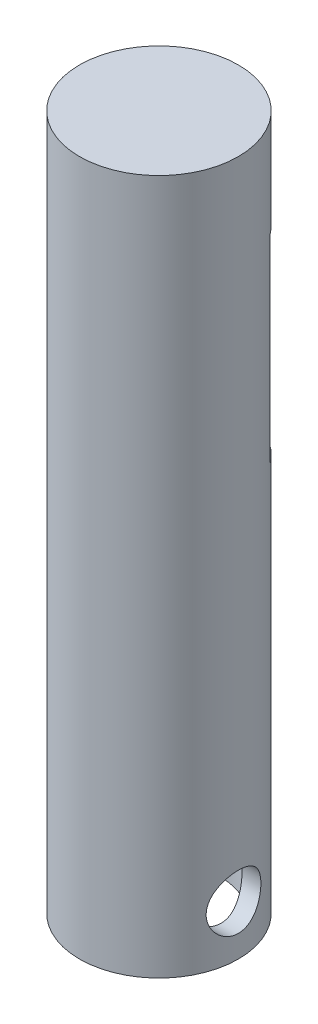
ISO-10303-21;
HEADER;
FILE_DESCRIPTION(('STEP AP214'),'2;1');
FILE_NAME('part.step','',(''),(''),'','','');
FILE_SCHEMA(('AUTOMOTIVE_DESIGN { 1 0 10303 214 1 1 1 1 }'));
ENDSEC;
DATA;
#1=APPLICATION_CONTEXT('core data for automotive mechanical design processes');
#2=APPLICATION_PROTOCOL_DEFINITION('international standard','automotive_design',2000,#1);
#3=PRODUCT_CONTEXT('',#1,'mechanical');
#4=PRODUCT('Part','Part','',(#3));
#5=PRODUCT_RELATED_PRODUCT_CATEGORY('part','',(#4));
#6=PRODUCT_DEFINITION_FORMATION('','',#4);
#7=PRODUCT_DEFINITION_CONTEXT('part definition',#1,'design');
#8=PRODUCT_DEFINITION('design','',#6,#7);
#9=PRODUCT_DEFINITION_SHAPE('','',#8);
#10=(LENGTH_UNIT() NAMED_UNIT(*) SI_UNIT(.MILLI.,.METRE.));
#11=(NAMED_UNIT(*) PLANE_ANGLE_UNIT() SI_UNIT($,.RADIAN.));
#12=(NAMED_UNIT(*) SI_UNIT($,.STERADIAN.) SOLID_ANGLE_UNIT());
#13=UNCERTAINTY_MEASURE_WITH_UNIT(LENGTH_MEASURE(1.E-05),#10,'distance_accuracy_value','');
#14=(GEOMETRIC_REPRESENTATION_CONTEXT(3) GLOBAL_UNCERTAINTY_ASSIGNED_CONTEXT((#13)) GLOBAL_UNIT_ASSIGNED_CONTEXT((#10,
#11,#12)) REPRESENTATION_CONTEXT('',''));
#15=CARTESIAN_POINT('',(0.,0.,0.));
#16=DIRECTION('',(0.,0.,1.));
#17=DIRECTION('',(1.,0.,0.));
#18=AXIS2_PLACEMENT_3D('',#15,#16,#17);
#19=CARTESIAN_POINT('',(-4.09956095210207,44.45,-3.));
#20=DIRECTION('',(0.,0.,1.));
#21=DIRECTION('',(1.,0.,0.));
#22=AXIS2_PLACEMENT_3D('',#19,#20,#21);
#23=PLANE('',#22);
#24=DIRECTION('',(0.,-1.,0.));
#25=VECTOR('',#24,1.);
#26=CARTESIAN_POINT('',(-4.09956095210207,44.45,-3.));
#27=LINE('',#26,#25);
#28=CARTESIAN_POINT('',(-4.09956095210207,38.1,-3.));
#29=VERTEX_POINT('',#28);
#30=CARTESIAN_POINT('',(-4.09956095210207,25.4,-3.));
#31=VERTEX_POINT('',#30);
#32=EDGE_CURVE('E60',#29,#31,#27,.T.);
#33=ORIENTED_EDGE('',*,*,#32,.F.);
#34=DIRECTION('',(1.,0.,0.));
#35=VECTOR('',#34,1.);
#36=CARTESIAN_POINT('',(-4.09956095210207,38.1,-3.));
#37=LINE('',#36,#35);
#38=CARTESIAN_POINT('',(4.09956095210207,38.1,-3.));
#39=VERTEX_POINT('',#38);
#40=EDGE_CURVE('E81',#29,#39,#37,.T.);
#41=ORIENTED_EDGE('',*,*,#40,.T.);
#42=DIRECTION('',(0.,-1.,0.));
#43=VECTOR('',#42,1.);
#44=CARTESIAN_POINT('',(4.09956095210207,44.45,-3.));
#45=LINE('',#44,#43);
#46=CARTESIAN_POINT('',(4.09956095210207,25.4,-3.));
#47=VERTEX_POINT('',#46);
#48=EDGE_CURVE('E11',#39,#47,#45,.T.);
#49=ORIENTED_EDGE('',*,*,#48,.T.);
#50=DIRECTION('',(-1.,0.,0.));
#51=VECTOR('',#50,1.);
#52=CARTESIAN_POINT('',(-4.09956095210207,25.4,-3.));
#53=LINE('',#52,#51);
#54=EDGE_CURVE('E88',#47,#31,#53,.T.);
#55=ORIENTED_EDGE('',*,*,#54,.T.);
#56=EDGE_LOOP('',(#33,#41,#49,#55));
#57=FACE_BOUND('',#56,.T.);
#58=ADVANCED_FACE('F45',(#57),#23,.F.);
#59=CARTESIAN_POINT('',(0.,44.45,0.));
#60=DIRECTION('',(0.,-1.,0.));
#61=DIRECTION('',(0.,0.,-1.));
#62=AXIS2_PLACEMENT_3D('',#59,#60,#61);
#63=CYLINDRICAL_SURFACE('',#62,5.08);
#64=CARTESIAN_POINT('',(-5.08,1.425,0.));
#65=CARTESIAN_POINT('',(-5.08000076417139,1.42499888298344,-0.0953022894046354));
#66=CARTESIAN_POINT('',(-5.07729376806418,1.43281012606838,-0.190596676623148));
#67=CARTESIAN_POINT('',(-5.06676259877077,1.46374527864878,-0.378367669756982));
#68=CARTESIAN_POINT('',(-5.05893823434203,1.48686976041974,-0.47084417022913));
#69=CARTESIAN_POINT('',(-5.03901989437365,1.54753702115389,-0.650245310243442));
#70=CARTESIAN_POINT('',(-5.02693334790221,1.58505472238807,-0.737179301137623));
#71=CARTESIAN_POINT('',(-4.99971650406148,1.67332640539515,-0.903519559470689));
#72=CARTESIAN_POINT('',(-4.98458554458919,1.72408326715122,-0.982924183876474));
#73=CARTESIAN_POINT('',(-4.95224369163693,1.83934569213979,-1.13486510405637));
#74=CARTESIAN_POINT('',(-4.93498055615565,1.90425047545211,-1.20708735593848));
#75=CARTESIAN_POINT('',(-4.90059932312551,2.04511803291619,-1.3398654200046));
#76=CARTESIAN_POINT('',(-4.88348126144282,2.12108346175875,-1.40041842329567));
#77=CARTESIAN_POINT('',(-4.85074524283585,2.28480469580415,-1.50998326193888));
#78=CARTESIAN_POINT('',(-4.83519045490759,2.37285359415443,-1.5585778443389));
#79=CARTESIAN_POINT('',(-4.80814126026735,2.55649635413827,-1.64013337052184));
#80=CARTESIAN_POINT('',(-4.7966455179427,2.65208772126229,-1.673099458024));
#81=CARTESIAN_POINT('',(-4.77956823029384,2.84451762278586,-1.72126802641745));
#82=CARTESIAN_POINT('',(-4.77379041311777,2.94119014167376,-1.73706200636142));
#83=CARTESIAN_POINT('',(-4.7682240603983,3.1359725044686,-1.75228747211399));
#84=CARTESIAN_POINT('',(-4.76843352235059,3.23408185683982,-1.75172442868868));
#85=CARTESIAN_POINT('',(-4.77464676631466,3.42381842371857,-1.73470925747026));
#86=CARTESIAN_POINT('',(-4.7803647153572,3.51552693796071,-1.7190409084115));
#87=CARTESIAN_POINT('',(-4.7964810683342,3.69492360970281,-1.67354289391217));
#88=CARTESIAN_POINT('',(-4.80688006860106,3.78261125340394,-1.64371142416492));
#89=CARTESIAN_POINT('',(-4.83138213156251,3.95321003018773,-1.57024282036418));
#90=CARTESIAN_POINT('',(-4.84554477898035,4.0360154970476,-1.52638105822024));
#91=CARTESIAN_POINT('',(-4.87595471261031,4.19333342515898,-1.42625295769855));
#92=CARTESIAN_POINT('',(-4.89220263252777,4.26784335252389,-1.36998284472751));
#93=CARTESIAN_POINT('',(-4.92606434263048,4.41084327761265,-1.24291697117403));
#94=CARTESIAN_POINT('',(-4.94370366507709,4.47876240132104,-1.17148418312147));
#95=CARTESIAN_POINT('',(-4.97756821276516,4.60181183787153,-1.0180281654083));
#96=CARTESIAN_POINT('',(-4.99379328315644,4.65694075137539,-0.936003778479532));
#97=CARTESIAN_POINT('',(-5.02324014996034,4.75334668663191,-0.762419583781975));
#98=CARTESIAN_POINT('',(-5.03642618865668,4.79446126746685,-0.670763072389918));
#99=CARTESIAN_POINT('',(-5.05804849306172,4.86050758126078,-0.481270310648696));
#100=CARTESIAN_POINT('',(-5.06648652588555,4.88544533544783,-0.383436374514577));
#101=CARTESIAN_POINT('',(-5.07736470824786,4.91739674973,-0.189191562688342));
#102=CARTESIAN_POINT('',(-5.08006255074176,4.92518108784578,-0.0929217284429427));
#103=CARTESIAN_POINT('',(-5.07993527174129,4.92481259103972,0.0995737310802911));
#104=CARTESIAN_POINT('',(-5.07711115498479,4.91666265540917,0.195799361214731));
#105=CARTESIAN_POINT('',(-5.06642755118415,4.88526116906746,0.382327466649308));
#106=CARTESIAN_POINT('',(-5.05872860986491,4.86249079813248,0.47272106198722));
#107=CARTESIAN_POINT('',(-5.03923022783173,4.80310457615501,0.648362037037884));
#108=CARTESIAN_POINT('',(-5.02743025855858,4.76648694036023,0.733608751734102));
#109=CARTESIAN_POINT('',(-5.00051950138979,4.67934532289421,0.899127908413318));
#110=CARTESIAN_POINT('',(-4.98532728267042,4.62846970369632,0.979201596971832));
#111=CARTESIAN_POINT('',(-4.95334472883728,4.51466497785025,1.12992112454148));
#112=CARTESIAN_POINT('',(-4.93655387786689,4.45173197377301,1.20056390254257));
#113=CARTESIAN_POINT('',(-4.90222616063926,4.31197933022608,1.33400086887325));
#114=CARTESIAN_POINT('',(-4.88469277729518,4.23463274627004,1.39624543446077));
#115=CARTESIAN_POINT('',(-4.8516851925527,4.07022171659723,1.50695005136838));
#116=CARTESIAN_POINT('',(-4.83621104355525,3.98315702368928,1.5554097519434));
#117=CARTESIAN_POINT('',(-4.80920827570578,3.80159517486444,1.63700095794269));
#118=CARTESIAN_POINT('',(-4.79767683455897,3.70710339529585,1.6701434338448));
#119=CARTESIAN_POINT('',(-4.78007607736265,3.51338547077514,1.7198785637945));
#120=CARTESIAN_POINT('',(-4.77400407556927,3.41416167903974,1.73647935587622));
#121=CARTESIAN_POINT('',(-4.76832880519632,3.2196445169891,1.75199936276655));
#122=CARTESIAN_POINT('',(-4.76838950172282,3.124433472804,1.75183708142949));
#123=CARTESIAN_POINT('',(-4.77413399674614,2.93547219974782,1.73612009740496));
#124=CARTESIAN_POINT('',(-4.77981741544765,2.84172187264485,1.7205664343517));
#125=CARTESIAN_POINT('',(-4.79590870235624,2.66037843893273,1.67517649822772));
#126=CARTESIAN_POINT('',(-4.80621143526942,2.57269589259309,1.64565729673398));
#127=CARTESIAN_POINT('',(-4.83033550622056,2.40346388522219,1.57343621637384));
#128=CARTESIAN_POINT('',(-4.84415765713431,2.32191584671541,1.53073129153142));
#129=CARTESIAN_POINT('',(-4.87455611963841,2.1631952851576,1.43105993979702));
#130=CARTESIAN_POINT('',(-4.8912299318905,2.08639704796838,1.37352745048766));
#131=CARTESIAN_POINT('',(-4.92506481046858,1.94324899744513,1.24676977081576));
#132=CARTESIAN_POINT('',(-4.94222601772023,1.8769022431187,1.17754116940141));
#133=CARTESIAN_POINT('',(-4.97598182225602,1.75367623225257,1.02581147627507));
#134=CARTESIAN_POINT('',(-4.9925209515745,1.69732208706302,0.942869931500976));
#135=CARTESIAN_POINT('',(-5.02237104941033,1.59940724242884,0.768135099027858));
#136=CARTESIAN_POINT('',(-5.03568258139335,1.5578439602398,0.676343360289376));
#137=CARTESIAN_POINT('',(-5.057313033813,1.49170746368237,0.488579092856818));
#138=CARTESIAN_POINT('',(-5.06573637649884,1.46677704899873,0.392744891698378));
#139=CARTESIAN_POINT('',(-5.07707856770794,1.43342658198853,0.197936932159695));
#140=CARTESIAN_POINT('',(-5.07999920646593,1.42500115993705,0.0989642055179746));
#141=CARTESIAN_POINT('',(-5.08,1.425,0.));
#142=B_SPLINE_CURVE_WITH_KNOTS('',3,(#64,#65,#66,#67,#68,#69,#70,#71,#72,#73,#74,#75,#76,#77,
#78,#79,#80,#81,#82,#83,#84,#85,#86,#87,#88,#89,#90,#91,#92,#93,#94,#95,#96,#97,#98,#99,#100,
#101,#102,#103,#104,#105,#106,#107,#108,#109,#110,#111,#112,#113,#114,#115,#116,#117,#118,#119,
#120,#121,#122,#123,#124,#125,#126,#127,#128,#129,#130,#131,#132,#133,#134,#135,#136,#137,#138,
#139,#140,#141),.UNSPECIFIED.,.T.,.F.,(4,2,2,2,2,2,2,2,2,2,2,2,2,2,2,2,2,2,2,2,2,2,2,2,2,2,2,2,
2,2,2,2,2,2,2,2,2,2,4),(0.,0.28554245735073,0.571095586393906,0.856153430964964,
1.14127333743709,1.43582379151039,1.73044505820538,2.03422433359474,2.33790355827745,
2.63075417899062,2.92350685408384,3.20184374340621,3.4802161008948,3.76328930846856,
4.04644874537624,4.34546697981625,4.64451791352625,4.94692583577289,5.24922113312124,
5.53763138501627,5.82598916464153,6.10531183706105,6.38467052321974,6.67163893049573,
6.95870025441647,7.259738612517,7.56078462961697,7.861614696605,8.16229669064574,
8.44651256584106,8.73070924455449,9.00874237277514,9.28683977632026,9.57774034565015,
9.86872590007664,10.1721342268066,10.4754895470881,10.7721002657753,11.0686144692629),.UNSPECIFIED.);
#143=CARTESIAN_POINT('',(-5.08,1.425,0.));
#144=VERTEX_POINT('',#143);
#145=EDGE_CURVE('E121',#144,#144,#142,.T.);
#146=ORIENTED_EDGE('',*,*,#145,.T.);
#147=EDGE_LOOP('',(#146));
#148=FACE_BOUND('',#147,.T.);
#149=CARTESIAN_POINT('',(4.7690565104641,3.175,-1.75));
#150=CARTESIAN_POINT('',(4.76905556914904,3.07988747420598,-1.75000115055899));
#151=CARTESIAN_POINT('',(4.7719329096654,2.98478292043442,-1.74221982424718));
#152=CARTESIAN_POINT('',(4.78306637000255,2.79740440264574,-1.71141431450612));
#153=CARTESIAN_POINT('',(4.79132307976023,2.7051307502461,-1.68838845925741));
#154=CARTESIAN_POINT('',(4.81217143890979,2.52616153887322,-1.62800914605608));
#155=CARTESIAN_POINT('',(4.82475411409451,2.43945486966273,-1.59068533102593));
#156=CARTESIAN_POINT('',(4.85282324821151,2.27350401676104,-1.50287190862797));
#157=CARTESIAN_POINT('',(4.86831041348106,2.19426165535709,-1.45237909754841));
#158=CARTESIAN_POINT('',(4.90116976927398,2.04217469887006,-1.3373989035908));
#159=CARTESIAN_POINT('',(4.91859121749096,1.96968747303741,-1.27245277915461));
#160=CARTESIAN_POINT('',(4.95294128003509,1.83638763566958,-1.13138709657144));
#161=CARTESIAN_POINT('',(4.9698698085748,1.77557704614716,-1.05526560723552));
#162=CARTESIAN_POINT('',(5.00190083776634,1.66570978297738,-0.891371207438888));
#163=CARTESIAN_POINT('',(5.01693870800215,1.61703114933825,-0.80333112554146));
#164=CARTESIAN_POINT('',(5.04291070662366,1.53531811335215,-0.619704280453341));
#165=CARTESIAN_POINT('',(5.0538460211813,1.50227918837186,-0.524119708290492));
#166=CARTESIAN_POINT('',(5.07003171382049,1.45400588242238,-0.331866809154855));
#167=CARTESIAN_POINT('',(5.07547728742448,1.43815852019928,-0.235369140953188));
#168=CARTESIAN_POINT('',(5.0807647730657,1.4227652712637,-0.0409408557045194));
#169=CARTESIAN_POINT('',(5.08060822560794,1.42321490310604,0.0569893600078222));
#170=CARTESIAN_POINT('',(5.07483931379797,1.44002222149091,0.247150116093957));
#171=CARTESIAN_POINT('',(5.06945556883223,1.45571331226731,0.339447661898226));
#172=CARTESIAN_POINT('',(5.0541275142818,1.50145093581419,0.520008887816919));
#173=CARTESIAN_POINT('',(5.04418289072104,1.5314984569036,0.608272289756216));
#174=CARTESIAN_POINT('',(5.02056796587733,1.60546405389829,0.779672864057162));
#175=CARTESIAN_POINT('',(5.00684890896013,1.64956493134931,0.862724156143934));
#176=CARTESIAN_POINT('',(4.97710307831595,1.75023214660339,1.02043880070284));
#177=CARTESIAN_POINT('',(4.96107563374108,1.80680211063098,1.09509970354941));
#178=CARTESIAN_POINT('',(4.92744592703843,1.93412390476673,1.23787149472358));
#179=CARTESIAN_POINT('',(4.90980499463016,2.00544398626107,1.30546727076063));
#180=CARTESIAN_POINT('',(4.87560416397293,2.15854768847578,1.42791298131385));
#181=CARTESIAN_POINT('',(4.85904445714819,2.24033315448165,1.48276066323594));
#182=CARTESIAN_POINT('',(4.82866075249325,2.41377958306261,1.57893310908967));
#183=CARTESIAN_POINT('',(4.81488521319719,2.50557860981672,1.62002537024872));
#184=CARTESIAN_POINT('',(4.79218901649874,2.69538908468421,1.68598805538193));
#185=CARTESIAN_POINT('',(4.78326615735245,2.79339769283005,1.71086583716083));
#186=CARTESIAN_POINT('',(4.77178917017154,2.98782735160336,1.7426133044508));
#187=CARTESIAN_POINT('',(4.76895099785174,3.08410034468289,1.75028695290477));
#188=CARTESIAN_POINT('',(4.76916800232093,3.2765797249177,1.74969675244721));
#189=CARTESIAN_POINT('',(4.77222201305147,3.37278612148323,1.74143605693008));
#190=CARTESIAN_POINT('',(4.78359466867962,3.558629134808,1.70993596023239));
#191=CARTESIAN_POINT('',(4.79171128864077,3.64837679174769,1.68727074722903));
#192=CARTESIAN_POINT('',(4.81206786840227,3.82277176693781,1.62830249292802));
#193=CARTESIAN_POINT('',(4.82430858986062,3.90741813965295,1.59199693232564));
#194=CARTESIAN_POINT('',(4.85203832915389,4.07233565336124,1.50540713933863));
#195=CARTESIAN_POINT('',(4.86762197904012,4.15236708169748,1.45469749836615));
#196=CARTESIAN_POINT('',(4.90010462316924,4.30307419797249,1.34121326936852));
#197=CARTESIAN_POINT('',(4.91700402923975,4.37374693782527,1.27843489476082));
#198=CARTESIAN_POINT('',(4.95127565012691,4.5075284691492,1.1387263364332));
#199=CARTESIAN_POINT('',(4.96862682758683,4.5700536791983,1.06123044254898));
#200=CARTESIAN_POINT('',(5.00098757627087,4.68125832759988,0.896418310268707));
#201=CARTESIAN_POINT('',(5.01599721243007,4.72993814994025,0.809102344316199));
#202=CARTESIAN_POINT('',(5.0419258298284,4.81164702246801,0.627485452305796));
#203=CARTESIAN_POINT('',(5.05286892162005,4.84476863695764,0.533229799201697));
#204=CARTESIAN_POINT('',(5.06953271796469,4.89454028155123,0.3400313655671));
#205=CARTESIAN_POINT('',(5.0752554510321,4.9111967098682,0.241090421370121));
#206=CARTESIAN_POINT('',(5.08067037137377,4.92695893509937,0.0466503973213572));
#207=CARTESIAN_POINT('',(5.08064956160638,4.92689998953546,-0.0487736803247511));
#208=CARTESIAN_POINT('',(5.07529708655824,4.91131621938358,-0.238189174721599));
#209=CARTESIAN_POINT('',(5.06996590259638,4.89579279645671,-0.332180720529504));
#210=CARTESIAN_POINT('',(5.05470419403585,4.85028507686571,-0.514375710295137));
#211=CARTESIAN_POINT('',(5.044857826666,4.82056498260139,-0.602652706525786));
#212=CARTESIAN_POINT('',(5.02158108655565,4.74775637973396,-0.772995362710569));
#213=CARTESIAN_POINT('',(5.00815005263131,4.70466540466266,-0.855059873197275));
#214=CARTESIAN_POINT('',(4.97843483147227,4.60443590945816,-1.01409288438825));
#215=CARTESIAN_POINT('',(4.96206078335882,4.54682088677738,-1.09074403385586));
#216=CARTESIAN_POINT('',(4.92850099023844,4.4199733722534,-1.23355969183976));
#217=CARTESIAN_POINT('',(4.91131497883972,4.35073704836595,-1.29972072727337));
#218=CARTESIAN_POINT('',(4.8771902232275,4.19909083817359,-1.42255286974433));
#219=CARTESIAN_POINT('',(4.86029319551149,4.11624542909985,-1.47869968866723));
#220=CARTESIAN_POINT('',(4.82954132449233,3.94176306862256,-1.57624826071803));
#221=CARTESIAN_POINT('',(4.81568594921604,3.85012765859078,-1.61765259303836));
#222=CARTESIAN_POINT('',(4.7930480532757,3.66270261896825,-1.68353371659624));
#223=CARTESIAN_POINT('',(4.78415804925797,3.56705351730717,-1.70837163007594));
#224=CARTESIAN_POINT('',(4.77216395819655,3.37259919871254,-1.74160078741207));
#225=CARTESIAN_POINT('',(4.76905748822704,3.27379529869097,-1.74999880489118));
#226=CARTESIAN_POINT('',(4.7690565104641,3.175,-1.75));
#227=B_SPLINE_CURVE_WITH_KNOTS('',3,(#149,#150,#151,#152,#153,#154,#155,#156,#157,#158,#159,
#160,#161,#162,#163,#164,#165,#166,#167,#168,#169,#170,#171,#172,#173,#174,#175,#176,#177,#178,
#179,#180,#181,#182,#183,#184,#185,#186,#187,#188,#189,#190,#191,#192,#193,#194,#195,#196,#197,
#198,#199,#200,#201,#202,#203,#204,#205,#206,#207,#208,#209,#210,#211,#212,#213,#214,#215,#216,
#217,#218,#219,#220,#221,#222,#223,#224,#225,#226),.UNSPECIFIED.,.T.,.F.,(4,2,2,2,2,2,2,2,2,2,2,
2,2,2,2,2,2,2,2,2,2,2,2,2,2,2,2,2,2,2,2,2,2,2,2,2,2,2,4),(0.,0.284971195180313,
0.569973647431364,0.854388394918185,1.13887239857133,1.4341628580342,1.72950440615435,
2.03313995737502,2.33668765066606,2.62901507806795,2.92126212013066,3.20127759380623,
3.48131234695925,3.76514955734467,4.04906942163075,4.34720470444387,4.64539262791601,
4.94839242856386,5.25125463808838,5.53963969117045,5.82796767892785,6.10546728392768,
6.38301816694734,6.66981576058982,6.95670348468211,7.25849315026459,7.56027444519834,
7.860236796492,8.16008253942545,8.4449479428232,8.7297875290905,9.00952129986325,
9.28930670261408,9.57985194581197,9.87049318319931,10.173514791287,10.4764833597812,
10.7726107243924,11.0686160518835),.UNSPECIFIED.);
#228=CARTESIAN_POINT('',(4.7690565104641,3.175,-1.75));
#229=VERTEX_POINT('',#228);
#230=EDGE_CURVE('E116',#229,#229,#227,.T.);
#231=ORIENTED_EDGE('',*,*,#230,.T.);
#232=EDGE_LOOP('',(#231));
#233=FACE_BOUND('',#232,.T.);
#234=CARTESIAN_POINT('',(0.,38.1,0.));
#235=DIRECTION('',(0.,1.,0.));
#236=DIRECTION('',(0.,0.,-1.));
#237=AXIS2_PLACEMENT_3D('',#234,#235,#236);
#238=CIRCLE('',#237,5.08);
#239=EDGE_CURVE('E77',#39,#29,#238,.T.);
#240=ORIENTED_EDGE('',*,*,#239,.T.);
#241=ORIENTED_EDGE('',*,*,#32,.T.);
#242=CARTESIAN_POINT('',(0.,25.4,0.));
#243=DIRECTION('',(0.,-1.,0.));
#244=DIRECTION('',(0.,0.,-1.));
#245=AXIS2_PLACEMENT_3D('',#242,#243,#244);
#246=CIRCLE('',#245,5.08);
#247=EDGE_CURVE('E85',#31,#47,#246,.T.);
#248=ORIENTED_EDGE('',*,*,#247,.T.);
#249=ORIENTED_EDGE('',*,*,#48,.F.);
#250=EDGE_LOOP('',(#240,#241,#248,#249));
#251=FACE_BOUND('',#250,.T.);
#252=CARTESIAN_POINT('',(0.,0.,0.));
#253=DIRECTION('',(0.,1.,0.));
#254=DIRECTION('',(0.,0.,1.));
#255=AXIS2_PLACEMENT_3D('',#252,#253,#254);
#256=CIRCLE('',#255,5.08);
#257=CARTESIAN_POINT('',(0.,0.,5.08));
#258=VERTEX_POINT('',#257);
#259=EDGE_CURVE('E93',#258,#258,#256,.T.);
#260=ORIENTED_EDGE('',*,*,#259,.T.);
#261=EDGE_LOOP('',(#260));
#262=FACE_BOUND('',#261,.T.);
#263=CARTESIAN_POINT('',(0.,44.45,0.));
#264=DIRECTION('',(0.,1.,0.));
#265=DIRECTION('',(0.,0.,1.));
#266=AXIS2_PLACEMENT_3D('',#263,#264,#265);
#267=CIRCLE('',#266,5.08);
#268=CARTESIAN_POINT('',(0.,44.45,5.08));
#269=VERTEX_POINT('',#268);
#270=EDGE_CURVE('E90',#269,#269,#267,.T.);
#271=ORIENTED_EDGE('',*,*,#270,.F.);
#272=EDGE_LOOP('',(#271));
#273=FACE_BOUND('',#272,.T.);
#274=ADVANCED_FACE('F47',(#148,#233,#251,#262,#273),#63,.T.);
#275=CARTESIAN_POINT('',(0.,44.45,0.));
#276=DIRECTION('',(0.,1.,0.));
#277=DIRECTION('',(0.,0.,1.));
#278=AXIS2_PLACEMENT_3D('',#275,#276,#277);
#279=PLANE('',#278);
#280=ORIENTED_EDGE('',*,*,#270,.T.);
#281=EDGE_LOOP('',(#280));
#282=FACE_BOUND('',#281,.T.);
#283=ADVANCED_FACE('F140',(#282),#279,.T.);
#284=CARTESIAN_POINT('',(0.,0.,0.));
#285=DIRECTION('',(0.,1.,0.));
#286=DIRECTION('',(0.,0.,1.));
#287=AXIS2_PLACEMENT_3D('',#284,#285,#286);
#288=PLANE('',#287);
#289=CARTESIAN_POINT('',(0.,0.,0.));
#290=DIRECTION('',(0.,-1.,0.));
#291=DIRECTION('',(0.,0.,-1.));
#292=AXIS2_PLACEMENT_3D('',#289,#290,#291);
#293=CIRCLE('',#292,3.96875);
#294=CARTESIAN_POINT('',(0.,0.,-3.96875));
#295=VERTEX_POINT('',#294);
#296=EDGE_CURVE('E127',#295,#295,#293,.T.);
#297=ORIENTED_EDGE('',*,*,#296,.F.);
#298=EDGE_LOOP('',(#297));
#299=FACE_BOUND('',#298,.T.);
#300=ORIENTED_EDGE('',*,*,#259,.F.);
#301=EDGE_LOOP('',(#300));
#302=FACE_BOUND('',#301,.T.);
#303=ADVANCED_FACE('F137',(#299,#302),#288,.F.);
#304=CARTESIAN_POINT('',(0.,25.4,0.));
#305=DIRECTION('',(0.,-1.,0.));
#306=DIRECTION('',(0.,0.,-1.));
#307=AXIS2_PLACEMENT_3D('',#304,#305,#306);
#308=PLANE('',#307);
#309=ORIENTED_EDGE('',*,*,#247,.F.);
#310=ORIENTED_EDGE('',*,*,#54,.F.);
#311=EDGE_LOOP('',(#309,#310));
#312=FACE_BOUND('',#311,.T.);
#313=ADVANCED_FACE('F139',(#312),#308,.F.);
#314=CARTESIAN_POINT('',(0.,38.1,0.));
#315=DIRECTION('',(0.,-1.,0.));
#316=DIRECTION('',(0.,0.,-1.));
#317=AXIS2_PLACEMENT_3D('',#314,#315,#316);
#318=PLANE('',#317);
#319=ORIENTED_EDGE('',*,*,#239,.F.);
#320=ORIENTED_EDGE('',*,*,#40,.F.);
#321=EDGE_LOOP('',(#319,#320));
#322=FACE_BOUND('',#321,.T.);
#323=ADVANCED_FACE('F84',(#322),#318,.T.);
#324=CARTESIAN_POINT('',(0.,6.35,0.));
#325=DIRECTION('',(0.,-1.,0.));
#326=DIRECTION('',(0.,0.,-1.));
#327=AXIS2_PLACEMENT_3D('',#324,#325,#326);
#328=CYLINDRICAL_SURFACE('',#327,3.96875);
#329=CARTESIAN_POINT('',(-3.56208879205727,3.175,-1.75));
#330=CARTESIAN_POINT('',(-3.56209353838593,3.08224740691797,-1.74999563319547));
#331=CARTESIAN_POINT('',(-3.56576407056318,2.98934259981376,-1.74257902061585));
#332=CARTESIAN_POINT('',(-3.57995211973844,2.80626235860172,-1.71323438723364));
#333=CARTESIAN_POINT('',(-3.5904871603377,2.71609452964493,-1.69126922476247));
#334=CARTESIAN_POINT('',(-3.61696251479822,2.54146570624595,-1.63387370994394));
#335=CARTESIAN_POINT('',(-3.63287896212464,2.45698145522823,-1.59850273000797));
#336=CARTESIAN_POINT('',(-3.66828751091445,2.29516823960994,-1.51547774519868));
#337=CARTESIAN_POINT('',(-3.68777906305451,2.21783817849355,-1.46782562689624));
#338=CARTESIAN_POINT('',(-3.72966266869336,2.06708166582086,-1.35803293293338));
#339=CARTESIAN_POINT('',(-3.75216027824898,1.99421391145088,-1.29516509833842));
#340=CARTESIAN_POINT('',(-3.7966585858724,1.85963705486942,-1.15824885061117));
#341=CARTESIAN_POINT('',(-3.81865907520989,1.79793256639501,-1.08419583778055));
#342=CARTESIAN_POINT('',(-3.86099382006362,1.68446054672912,-0.922506160523575));
#343=CARTESIAN_POINT('',(-3.88119127911691,1.63333780227249,-0.83437788622718));
#344=CARTESIAN_POINT('',(-3.91633169743546,1.54688960151139,-0.649718371395728));
#345=CARTESIAN_POINT('',(-3.93127725444704,1.51155633290805,-0.553191314708836));
#346=CARTESIAN_POINT('',(-3.95347834999868,1.45976542764851,-0.360355757586166));
#347=CARTESIAN_POINT('',(-3.96112637963048,1.44233993556338,-0.264353338726685));
#348=CARTESIAN_POINT('',(-3.96930722106238,1.42371534042764,-0.0705036002533178));
#349=CARTESIAN_POINT('',(-3.96984328957249,1.42250881038484,0.0273428543820264));
#350=CARTESIAN_POINT('',(-3.96395886355778,1.43588531871159,0.215001917879778));
#351=CARTESIAN_POINT('',(-3.95800899588929,1.4494001107015,0.304908340775179));
#352=CARTESIAN_POINT('',(-3.9404855814644,1.48998259360306,0.481024011713773));
#353=CARTESIAN_POINT('',(-3.92891161837739,1.5170512878636,0.567232985534499));
#354=CARTESIAN_POINT('',(-3.90101968793415,1.58426926754532,0.735104863073158));
#355=CARTESIAN_POINT('',(-3.88463198291737,1.62461196920836,0.816678254143855));
#356=CARTESIAN_POINT('',(-3.84868139397731,1.71702809000756,0.972111971682959));
#357=CARTESIAN_POINT('',(-3.82911735624179,1.76910577458765,1.04596947925099));
#358=CARTESIAN_POINT('',(-3.78695193640457,1.88819626988817,1.18997020754851));
#359=CARTESIAN_POINT('',(-3.7642326663637,1.95605425426668,1.25938087431697));
#360=CARTESIAN_POINT('',(-3.71941135415986,2.10243498505653,1.38617737278033));
#361=CARTESIAN_POINT('',(-3.69730961437482,2.18096284941567,1.44355740002509));
#362=CARTESIAN_POINT('',(-3.65532460083709,2.3504296743786,1.54687431413554));
#363=CARTESIAN_POINT('',(-3.63556733412784,2.44174233830917,1.59225401038565));
#364=CARTESIAN_POINT('',(-3.60205795871447,2.63181194458514,1.66668544323578));
#365=CARTESIAN_POINT('',(-3.58830096562557,2.7305627549909,1.69575046597237));
#366=CARTESIAN_POINT('',(-3.56960518418745,2.92534472715134,1.73474330947598));
#367=CARTESIAN_POINT('',(-3.56411638258773,3.02108214651399,1.74586863973841));
#368=CARTESIAN_POINT('',(-3.56100105508922,3.21319290466881,1.75221765766862));
#369=CARTESIAN_POINT('',(-3.56337121546327,3.30956595834333,1.74744804742538));
#370=CARTESIAN_POINT('',(-3.57513324783105,3.49252520823142,1.7232383324921));
#371=CARTESIAN_POINT('',(-3.58398179461918,3.57930117106894,1.70493236127572));
#372=CARTESIAN_POINT('',(-3.60697879849733,3.74845544413854,1.65572114712787));
#373=CARTESIAN_POINT('',(-3.62112859785241,3.83083263457101,1.62481271310638));
#374=CARTESIAN_POINT('',(-3.65389481747196,3.99296259218139,1.54976490211927));
#375=CARTESIAN_POINT('',(-3.67268195932917,4.07243551616474,1.50509802943803));
#376=CARTESIAN_POINT('',(-3.71238927150009,4.22316743507872,1.40430554568507));
#377=CARTESIAN_POINT('',(-3.73331043383616,4.29442257679055,1.34817459314898));
#378=CARTESIAN_POINT('',(-3.77727956071602,4.43362099149512,1.21989455557735));
#379=CARTESIAN_POINT('',(-3.80034398865355,4.50063639388688,1.14674005876275));
#380=CARTESIAN_POINT('',(-3.84422469457359,4.62164138857364,0.989723349920827));
#381=CARTESIAN_POINT('',(-3.86504067624988,4.67562926522068,0.905859729786865));
#382=CARTESIAN_POINT('',(-3.90233949997183,4.76925178626268,0.728677439196114));
#383=CARTESIAN_POINT('',(-3.91878776807016,4.80877279273064,0.635290981699206));
#384=CARTESIAN_POINT('',(-3.94522903213664,4.8712202956881,0.442273890308923));
#385=CARTESIAN_POINT('',(-3.95522638147468,4.89415798460713,0.34264751730459));
#386=CARTESIAN_POINT('',(-3.96708486555638,4.92125842265785,0.148218466465073));
#387=CARTESIAN_POINT('',(-3.96951062715961,4.92672486607173,0.0536309408712299));
#388=CARTESIAN_POINT('',(-3.96757122067091,4.92232672090087,-0.135104825907965));
#389=CARTESIAN_POINT('',(-3.96320751248676,4.91246542816763,-0.229253157165397));
#390=CARTESIAN_POINT('',(-3.94849255842105,4.87862346373568,-0.4102177359374));
#391=CARTESIAN_POINT('',(-3.93840800526532,4.85527088780818,-0.497175040256969));
#392=CARTESIAN_POINT('',(-3.913420989435,4.79583685216382,-0.665875986453617));
#393=CARTESIAN_POINT('',(-3.89851767217411,4.7597531345322,-0.747618700465384));
#394=CARTESIAN_POINT('',(-3.86445798292642,4.6740574513603,-0.907714806758724));
#395=CARTESIAN_POINT('',(-3.84513801057888,4.62390132695005,-0.985741229116449));
#396=CARTESIAN_POINT('',(-3.80446881641556,4.51223907776838,-1.13261229457055));
#397=CARTESIAN_POINT('',(-3.78311874898595,4.45072821317317,-1.20145308254436));
#398=CARTESIAN_POINT('',(-3.73869080353766,4.31251361184784,-1.33356456338859));
#399=CARTESIAN_POINT('',(-3.71560713068347,4.23500231939152,-1.39599136661912));
#400=CARTESIAN_POINT('',(-3.67193674837275,4.06996527552658,-1.50712793845824));
#401=CARTESIAN_POINT('',(-3.65135157638443,3.98243342162634,-1.55582928514161));
#402=CARTESIAN_POINT('',(-3.61524974380851,3.79920497474954,-1.6379790330275));
#403=CARTESIAN_POINT('',(-3.59974592369513,3.70348845643481,-1.67138887600855));
#404=CARTESIAN_POINT('',(-3.57621311955068,3.50702445583213,-1.72117916216989));
#405=CARTESIAN_POINT('',(-3.56815906490183,3.4062950584507,-1.73761674380392));
#406=CARTESIAN_POINT('',(-3.56366883587143,3.28332782715188,-1.74677964847133));
#407=CARTESIAN_POINT('',(-3.56307756802898,3.26168661239528,-1.74798610752484));
#408=CARTESIAN_POINT('',(-3.5622869863916,3.21836637296077,-1.74959680371416));
#409=CARTESIAN_POINT('',(-3.56208768227397,3.19668734736256,-1.75000102104323));
#410=CARTESIAN_POINT('',(-3.56208879205727,3.175,-1.75));
#411=B_SPLINE_CURVE_WITH_KNOTS('',3,(#329,#330,#331,#332,#333,#334,#335,#336,#337,#338,#339,
#340,#341,#342,#343,#344,#345,#346,#347,#348,#349,#350,#351,#352,#353,#354,#355,#356,#357,#358,
#359,#360,#361,#362,#363,#364,#365,#366,#367,#368,#369,#370,#371,#372,#373,#374,#375,#376,#377,
#378,#379,#380,#381,#382,#383,#384,#385,#386,#387,#388,#389,#390,#391,#392,#393,#394,#395,#396,
#397,#398,#399,#400,#401,#402,#403,#404,#405,#406,#407,#408,#409,#410),.UNSPECIFIED.,.T.,.F.,(4,
2,2,2,2,2,2,2,2,2,2,2,2,2,2,2,2,2,2,2,2,2,2,2,2,2,2,2,2,2,2,2,2,2,2,2,2,2,2,2,4),(0.,
0.278166493433298,0.557045882401051,0.834704320937761,1.11232013228369,1.40754438936983,
1.70289038420353,2.01288757708766,2.3227312196294,2.61477292458695,2.90668089315732,
3.17873660303953,3.45081245525045,3.72704262376208,4.0033733591295,4.30113958614739,
4.5990491481955,4.90901711969207,5.21873229581556,5.50676075035845,5.79466777330182,
6.06085047730066,6.32710062375157,6.60519700096026,6.88342324856538,7.18758462827953,
7.49178604241135,7.79832814657264,8.10466316539236,8.38753046958766,8.67033695856148,
8.94093121191268,9.21157348029251,9.4946179362679,9.7777808121338,10.0828667001033,
10.3881393828817,10.6941776402949,10.9991822028825,11.0642212948376,11.1292619925394),.UNSPECIFIED.);
#412=CARTESIAN_POINT('',(-3.56208879205727,3.175,-1.75));
#413=VERTEX_POINT('',#412);
#414=EDGE_CURVE('E50',#413,#413,#411,.T.);
#415=ORIENTED_EDGE('',*,*,#414,.T.);
#416=EDGE_LOOP('',(#415));
#417=FACE_BOUND('',#416,.T.);
#418=CARTESIAN_POINT('',(3.56208879205727,3.175,-1.75));
#419=CARTESIAN_POINT('',(3.56209353838593,3.26775259308203,-1.74999563319547));
#420=CARTESIAN_POINT('',(3.56576407056318,3.36065740018624,-1.74257902061585));
#421=CARTESIAN_POINT('',(3.57995211973844,3.54373764139828,-1.71323438723364));
#422=CARTESIAN_POINT('',(3.5904871603377,3.63390547035507,-1.69126922476247));
#423=CARTESIAN_POINT('',(3.61696251479822,3.80853429375405,-1.63387370994394));
#424=CARTESIAN_POINT('',(3.63287896212464,3.89301854477177,-1.59850273000797));
#425=CARTESIAN_POINT('',(3.66828751091445,4.05483176039005,-1.51547774519868));
#426=CARTESIAN_POINT('',(3.68777906305451,4.13216182150645,-1.46782562689624));
#427=CARTESIAN_POINT('',(3.72966266869336,4.28291833417914,-1.35803293293338));
#428=CARTESIAN_POINT('',(3.75216027824898,4.35578608854912,-1.29516509833842));
#429=CARTESIAN_POINT('',(3.7966585858724,4.49036294513058,-1.15824885061117));
#430=CARTESIAN_POINT('',(3.81865907520989,4.55206743360499,-1.08419583778055));
#431=CARTESIAN_POINT('',(3.86099382006362,4.66553945327088,-0.922506160523575));
#432=CARTESIAN_POINT('',(3.88119127911691,4.71666219772751,-0.834377886227179));
#433=CARTESIAN_POINT('',(3.91633169743546,4.80311039848861,-0.649718371395727));
#434=CARTESIAN_POINT('',(3.93127725444704,4.83844366709194,-0.553191314708836));
#435=CARTESIAN_POINT('',(3.95347834999868,4.89023457235149,-0.360355757586165));
#436=CARTESIAN_POINT('',(3.96112637963048,4.90766006443662,-0.264353338726685));
#437=CARTESIAN_POINT('',(3.96930722106238,4.92628465957236,-0.0705036002533174));
#438=CARTESIAN_POINT('',(3.96984328957249,4.92749118961516,0.0273428543820268));
#439=CARTESIAN_POINT('',(3.96395886355778,4.91411468128841,0.215001917879779));
#440=CARTESIAN_POINT('',(3.95800899588929,4.9005998892985,0.304908340775179));
#441=CARTESIAN_POINT('',(3.9404855814644,4.86001740639694,0.481024011713773));
#442=CARTESIAN_POINT('',(3.92891161837739,4.8329487121364,0.567232985534499));
#443=CARTESIAN_POINT('',(3.90101968793415,4.76573073245468,0.735104863073158));
#444=CARTESIAN_POINT('',(3.88463198291737,4.72538803079164,0.816678254143855));
#445=CARTESIAN_POINT('',(3.84868139397731,4.63297190999244,0.972111971682959));
#446=CARTESIAN_POINT('',(3.82911735624179,4.58089422541235,1.04596947925099));
#447=CARTESIAN_POINT('',(3.78695193640457,4.46180373011183,1.18997020754851));
#448=CARTESIAN_POINT('',(3.7642326663637,4.39394574573332,1.25938087431697));
#449=CARTESIAN_POINT('',(3.71941135415986,4.24756501494346,1.38617737278033));
#450=CARTESIAN_POINT('',(3.69730961437482,4.16903715058433,1.44355740002509));
#451=CARTESIAN_POINT('',(3.65532460083709,3.9995703256214,1.54687431413554));
#452=CARTESIAN_POINT('',(3.63556733412784,3.90825766169083,1.59225401038565));
#453=CARTESIAN_POINT('',(3.60205795871447,3.71818805541486,1.66668544323578));
#454=CARTESIAN_POINT('',(3.58830096562557,3.6194372450091,1.69575046597237));
#455=CARTESIAN_POINT('',(3.56960518418745,3.42465527284866,1.73474330947598));
#456=CARTESIAN_POINT('',(3.56411638258773,3.32891785348601,1.74586863973841));
#457=CARTESIAN_POINT('',(3.56100105508922,3.13680709533119,1.75221765766862));
#458=CARTESIAN_POINT('',(3.56337121546327,3.04043404165667,1.74744804742538));
#459=CARTESIAN_POINT('',(3.57513324783105,2.85747479176858,1.7232383324921));
#460=CARTESIAN_POINT('',(3.58398179461918,2.77069882893106,1.70493236127572));
#461=CARTESIAN_POINT('',(3.60697879849733,2.60154455586146,1.65572114712787));
#462=CARTESIAN_POINT('',(3.62112859785241,2.51916736542899,1.62481271310638));
#463=CARTESIAN_POINT('',(3.65389481747196,2.35703740781861,1.54976490211927));
#464=CARTESIAN_POINT('',(3.67268195932917,2.27756448383526,1.50509802943803));
#465=CARTESIAN_POINT('',(3.71238927150009,2.12683256492128,1.40430554568507));
#466=CARTESIAN_POINT('',(3.73331043383616,2.05557742320946,1.34817459314898));
#467=CARTESIAN_POINT('',(3.77727956071602,1.91637900850488,1.21989455557736));
#468=CARTESIAN_POINT('',(3.80034398865355,1.84936360611312,1.14674005876275));
#469=CARTESIAN_POINT('',(3.84422469457359,1.72835861142636,0.989723349920828));
#470=CARTESIAN_POINT('',(3.86504067624988,1.67437073477932,0.905859729786866));
#471=CARTESIAN_POINT('',(3.90233949997183,1.58074821373732,0.728677439196115));
#472=CARTESIAN_POINT('',(3.91878776807016,1.54122720726936,0.635290981699207));
#473=CARTESIAN_POINT('',(3.94522903213664,1.4787797043119,0.442273890308924));
#474=CARTESIAN_POINT('',(3.95522638147468,1.45584201539287,0.342647517304591));
#475=CARTESIAN_POINT('',(3.96708486555638,1.42874157734215,0.148218466465074));
#476=CARTESIAN_POINT('',(3.96951062715961,1.42327513392827,0.0536309408712306));
#477=CARTESIAN_POINT('',(3.96757122067091,1.42767327909913,-0.135104825907965));
#478=CARTESIAN_POINT('',(3.96320751248676,1.43753457183237,-0.229253157165396));
#479=CARTESIAN_POINT('',(3.94849255842105,1.47137653626432,-0.410217735937399));
#480=CARTESIAN_POINT('',(3.93840800526532,1.49472911219182,-0.497175040256968));
#481=CARTESIAN_POINT('',(3.913420989435,1.55416314783618,-0.665875986453616));
#482=CARTESIAN_POINT('',(3.89851767217411,1.5902468654678,-0.747618700465384));
#483=CARTESIAN_POINT('',(3.86445798292642,1.6759425486397,-0.907714806758724));
#484=CARTESIAN_POINT('',(3.84513801057888,1.72609867304995,-0.985741229116449));
#485=CARTESIAN_POINT('',(3.80446881641556,1.83776092223162,-1.13261229457055));
#486=CARTESIAN_POINT('',(3.78311874898595,1.89927178682683,-1.20145308254436));
#487=CARTESIAN_POINT('',(3.73869080353766,2.03748638815215,-1.33356456338859));
#488=CARTESIAN_POINT('',(3.71560713068347,2.11499768060848,-1.39599136661912));
#489=CARTESIAN_POINT('',(3.67193674837275,2.28003472447342,-1.50712793845824));
#490=CARTESIAN_POINT('',(3.65135157638443,2.36756657837366,-1.55582928514161));
#491=CARTESIAN_POINT('',(3.61524974380851,2.55079502525046,-1.6379790330275));
#492=CARTESIAN_POINT('',(3.59974592369513,2.64651154356518,-1.67138887600855));
#493=CARTESIAN_POINT('',(3.57621311955068,2.84297554416787,-1.72117916216989));
#494=CARTESIAN_POINT('',(3.56815906490183,2.9437049415493,-1.73761674380392));
#495=CARTESIAN_POINT('',(3.56366883587143,3.06667217284812,-1.74677964847133));
#496=CARTESIAN_POINT('',(3.56307756802898,3.08831338760472,-1.74798610752484));
#497=CARTESIAN_POINT('',(3.5622869863916,3.13163362703923,-1.74959680371416));
#498=CARTESIAN_POINT('',(3.56208768227397,3.15331265263744,-1.75000102104323));
#499=CARTESIAN_POINT('',(3.56208879205727,3.175,-1.75));
#500=B_SPLINE_CURVE_WITH_KNOTS('',3,(#418,#419,#420,#421,#422,#423,#424,#425,#426,#427,#428,
#429,#430,#431,#432,#433,#434,#435,#436,#437,#438,#439,#440,#441,#442,#443,#444,#445,#446,#447,
#448,#449,#450,#451,#452,#453,#454,#455,#456,#457,#458,#459,#460,#461,#462,#463,#464,#465,#466,
#467,#468,#469,#470,#471,#472,#473,#474,#475,#476,#477,#478,#479,#480,#481,#482,#483,#484,#485,
#486,#487,#488,#489,#490,#491,#492,#493,#494,#495,#496,#497,#498,#499),.UNSPECIFIED.,.T.,.F.,(4,
2,2,2,2,2,2,2,2,2,2,2,2,2,2,2,2,2,2,2,2,2,2,2,2,2,2,2,2,2,2,2,2,2,2,2,2,2,2,2,4),(0.,
0.278166493433298,0.557045882401051,0.83470432093776,1.11232013228369,1.40754438936983,
1.70289038420353,2.01288757708766,2.3227312196294,2.61477292458695,2.90668089315732,
3.17873660303953,3.45081245525045,3.72704262376208,4.0033733591295,4.30113958614739,
4.5990491481955,4.90901711969207,5.21873229581556,5.50676075035845,5.79466777330182,
6.06085047730066,6.32710062375157,6.60519700096026,6.88342324856538,7.18758462827953,
7.49178604241135,7.79832814657264,8.10466316539236,8.38753046958766,8.67033695856148,
8.94093121191268,9.21157348029251,9.4946179362679,9.7777808121338,10.0828667001033,
10.3881393828817,10.6941776402949,10.9991822028825,11.0642212948376,11.1292619925394),.UNSPECIFIED.);
#501=CARTESIAN_POINT('',(3.56208879205727,3.175,-1.75));
#502=VERTEX_POINT('',#501);
#503=EDGE_CURVE('E96',#502,#502,#500,.T.);
#504=ORIENTED_EDGE('',*,*,#503,.T.);
#505=EDGE_LOOP('',(#504));
#506=FACE_BOUND('',#505,.T.);
#507=CARTESIAN_POINT('',(0.,6.35,0.));
#508=DIRECTION('',(0.,-1.,0.));
#509=DIRECTION('',(0.,0.,-1.));
#510=AXIS2_PLACEMENT_3D('',#507,#508,#509);
#511=CIRCLE('',#510,3.96875);
#512=CARTESIAN_POINT('',(0.,6.35,-3.96875));
#513=VERTEX_POINT('',#512);
#514=EDGE_CURVE('E82',#513,#513,#511,.T.);
#515=ORIENTED_EDGE('',*,*,#514,.F.);
#516=EDGE_LOOP('',(#515));
#517=FACE_BOUND('',#516,.T.);
#518=ORIENTED_EDGE('',*,*,#296,.T.);
#519=EDGE_LOOP('',(#518));
#520=FACE_BOUND('',#519,.T.);
#521=ADVANCED_FACE('F101',(#417,#506,#517,#520),#328,.F.);
#522=CARTESIAN_POINT('',(0.,6.35,0.));
#523=DIRECTION('',(0.,-1.,0.));
#524=DIRECTION('',(0.,0.,-1.));
#525=AXIS2_PLACEMENT_3D('',#522,#523,#524);
#526=PLANE('',#525);
#527=ORIENTED_EDGE('',*,*,#514,.T.);
#528=EDGE_LOOP('',(#527));
#529=FACE_BOUND('',#528,.T.);
#530=ADVANCED_FACE('F110',(#529),#526,.T.);
#531=CARTESIAN_POINT('',(-5.08,3.175,0.));
#532=DIRECTION('',(1.,0.,0.));
#533=DIRECTION('',(0.,0.,-1.));
#534=AXIS2_PLACEMENT_3D('',#531,#532,#533);
#535=CYLINDRICAL_SURFACE('',#534,1.75);
#536=ORIENTED_EDGE('',*,*,#503,.F.);
#537=EDGE_LOOP('',(#536));
#538=FACE_BOUND('',#537,.T.);
#539=ORIENTED_EDGE('',*,*,#230,.F.);
#540=EDGE_LOOP('',(#539));
#541=FACE_BOUND('',#540,.T.);
#542=ADVANCED_FACE('F108',(#538,#541),#535,.F.);
#543=ORIENTED_EDGE('',*,*,#414,.F.);
#544=EDGE_LOOP('',(#543));
#545=FACE_BOUND('',#544,.T.);
#546=ORIENTED_EDGE('',*,*,#145,.F.);
#547=EDGE_LOOP('',(#546));
#548=FACE_BOUND('',#547,.T.);
#549=ADVANCED_FACE('F105',(#545,#548),#535,.F.);
#550=CLOSED_SHELL('',(#58,#274,#283,#303,#313,#323,#521,#530,#542,#549));
#551=MANIFOLD_SOLID_BREP('B2',#550);
#552=ADVANCED_BREP_SHAPE_REPRESENTATION('',(#18,#551),#14);
#553=SHAPE_DEFINITION_REPRESENTATION(#9,#552);
ENDSEC;
END-ISO-10303-21;
